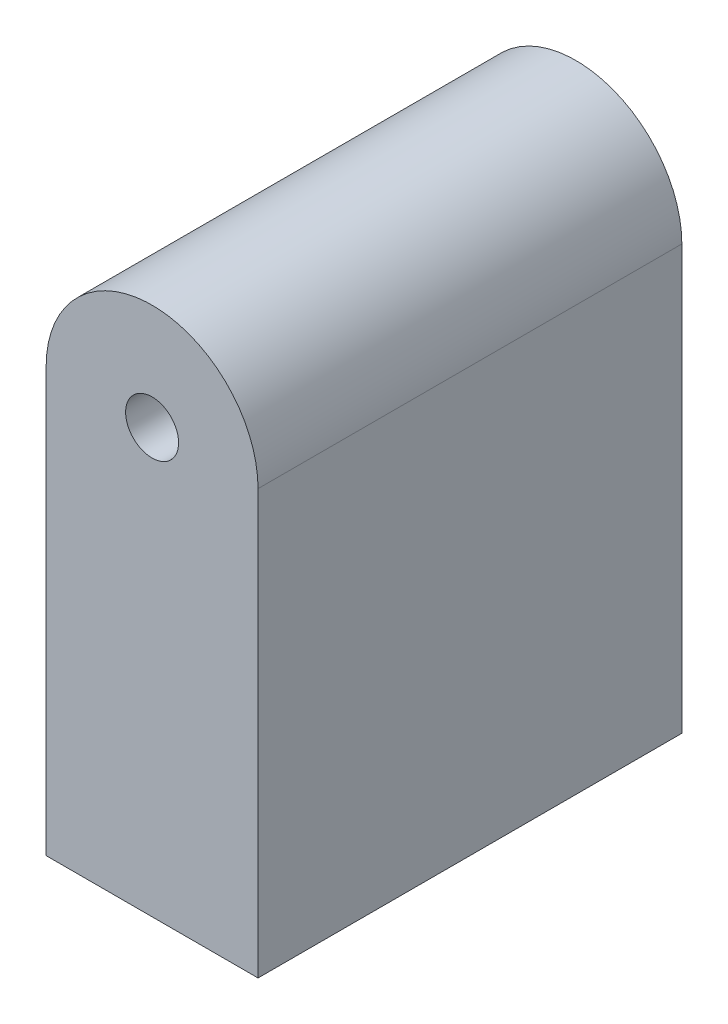
ISO-10303-21;
HEADER;
FILE_DESCRIPTION(('STEP AP214'),'2;1');
FILE_NAME('part.step','',(''),(''),'','','');
FILE_SCHEMA(('AUTOMOTIVE_DESIGN { 1 0 10303 214 1 1 1 1 }'));
ENDSEC;
DATA;
#1=APPLICATION_CONTEXT('core data for automotive mechanical design processes');
#2=APPLICATION_PROTOCOL_DEFINITION('international standard','automotive_design',2000,#1);
#3=PRODUCT_CONTEXT('',#1,'mechanical');
#4=PRODUCT('Part','Part','',(#3));
#5=PRODUCT_RELATED_PRODUCT_CATEGORY('part','',(#4));
#6=PRODUCT_DEFINITION_FORMATION('','',#4);
#7=PRODUCT_DEFINITION_CONTEXT('part definition',#1,'design');
#8=PRODUCT_DEFINITION('design','',#6,#7);
#9=PRODUCT_DEFINITION_SHAPE('','',#8);
#10=(LENGTH_UNIT() NAMED_UNIT(*) SI_UNIT(.MILLI.,.METRE.));
#11=(NAMED_UNIT(*) PLANE_ANGLE_UNIT() SI_UNIT($,.RADIAN.));
#12=(NAMED_UNIT(*) SI_UNIT($,.STERADIAN.) SOLID_ANGLE_UNIT());
#13=UNCERTAINTY_MEASURE_WITH_UNIT(LENGTH_MEASURE(1.E-05),#10,'distance_accuracy_value','');
#14=(GEOMETRIC_REPRESENTATION_CONTEXT(3) GLOBAL_UNCERTAINTY_ASSIGNED_CONTEXT((#13)) GLOBAL_UNIT_ASSIGNED_CONTEXT((#10,
#11,#12)) REPRESENTATION_CONTEXT('',''));
#15=CARTESIAN_POINT('',(0.,0.,0.));
#16=DIRECTION('',(0.,0.,1.));
#17=DIRECTION('',(1.,0.,0.));
#18=AXIS2_PLACEMENT_3D('',#15,#16,#17);
#19=CARTESIAN_POINT('',(12.7,50.8,50.8));
#20=DIRECTION('',(0.,0.,-1.));
#21=DIRECTION('',(-1.,0.,0.));
#22=AXIS2_PLACEMENT_3D('',#19,#20,#21);
#23=CYLINDRICAL_SURFACE('',#22,12.7);
#24=CARTESIAN_POINT('',(12.7,50.8,0.));
#25=DIRECTION('',(0.,0.,1.));
#26=DIRECTION('',(1.,0.,0.));
#27=AXIS2_PLACEMENT_3D('',#24,#25,#26);
#28=CIRCLE('',#27,12.7);
#29=CARTESIAN_POINT('',(25.4,50.8,0.));
#30=VERTEX_POINT('',#29);
#31=CARTESIAN_POINT('',(0.,50.8,0.));
#32=VERTEX_POINT('',#31);
#33=EDGE_CURVE('E120',#30,#32,#28,.T.);
#34=ORIENTED_EDGE('',*,*,#33,.T.);
#35=DIRECTION('',(0.,0.,-1.));
#36=VECTOR('',#35,1.);
#37=CARTESIAN_POINT('',(0.,50.8,50.8));
#38=LINE('',#37,#36);
#39=CARTESIAN_POINT('',(0.,50.8,50.8));
#40=VERTEX_POINT('',#39);
#41=EDGE_CURVE('E11',#40,#32,#38,.T.);
#42=ORIENTED_EDGE('',*,*,#41,.F.);
#43=CARTESIAN_POINT('',(12.7,50.8,50.8));
#44=DIRECTION('',(0.,0.,1.));
#45=DIRECTION('',(1.,0.,0.));
#46=AXIS2_PLACEMENT_3D('',#43,#44,#45);
#47=CIRCLE('',#46,12.7);
#48=CARTESIAN_POINT('',(25.4,50.8,50.8));
#49=VERTEX_POINT('',#48);
#50=EDGE_CURVE('E88',#49,#40,#47,.T.);
#51=ORIENTED_EDGE('',*,*,#50,.F.);
#52=DIRECTION('',(0.,0.,-1.));
#53=VECTOR('',#52,1.);
#54=CARTESIAN_POINT('',(25.4,50.8,50.8));
#55=LINE('',#54,#53);
#56=EDGE_CURVE('E119',#49,#30,#55,.T.);
#57=ORIENTED_EDGE('',*,*,#56,.T.);
#58=EDGE_LOOP('',(#34,#42,#51,#57));
#59=FACE_BOUND('',#58,.T.);
#60=ADVANCED_FACE('F45',(#59),#23,.T.);
#61=CARTESIAN_POINT('',(0.,0.,50.8));
#62=DIRECTION('',(-1.,0.,0.));
#63=DIRECTION('',(0.,-1.,0.));
#64=AXIS2_PLACEMENT_3D('',#61,#62,#63);
#65=PLANE('',#64);
#66=DIRECTION('',(0.,1.,0.));
#67=VECTOR('',#66,1.);
#68=CARTESIAN_POINT('',(0.,0.,0.));
#69=LINE('',#68,#67);
#70=CARTESIAN_POINT('',(0.,0.,0.));
#71=VERTEX_POINT('',#70);
#72=EDGE_CURVE('E98',#71,#32,#69,.T.);
#73=ORIENTED_EDGE('',*,*,#72,.F.);
#74=DIRECTION('',(0.,0.,-1.));
#75=VECTOR('',#74,1.);
#76=CARTESIAN_POINT('',(0.,0.,50.8));
#77=LINE('',#76,#75);
#78=CARTESIAN_POINT('',(0.,0.,50.8));
#79=VERTEX_POINT('',#78);
#80=EDGE_CURVE('E54',#79,#71,#77,.T.);
#81=ORIENTED_EDGE('',*,*,#80,.F.);
#82=DIRECTION('',(0.,1.,0.));
#83=VECTOR('',#82,1.);
#84=CARTESIAN_POINT('',(0.,0.,50.8));
#85=LINE('',#84,#83);
#86=EDGE_CURVE('E96',#79,#40,#85,.T.);
#87=ORIENTED_EDGE('',*,*,#86,.T.);
#88=ORIENTED_EDGE('',*,*,#41,.T.);
#89=EDGE_LOOP('',(#73,#81,#87,#88));
#90=FACE_BOUND('',#89,.T.);
#91=ADVANCED_FACE('F95',(#90),#65,.T.);
#92=CARTESIAN_POINT('',(0.,0.,50.8));
#93=DIRECTION('',(0.,1.,0.));
#94=DIRECTION('',(0.,0.,1.));
#95=AXIS2_PLACEMENT_3D('',#92,#93,#94);
#96=PLANE('',#95);
#97=DIRECTION('',(1.,0.,0.));
#98=VECTOR('',#97,1.);
#99=CARTESIAN_POINT('',(0.,0.,0.));
#100=LINE('',#99,#98);
#101=CARTESIAN_POINT('',(25.4,0.,0.));
#102=VERTEX_POINT('',#101);
#103=EDGE_CURVE('E77',#71,#102,#100,.T.);
#104=ORIENTED_EDGE('',*,*,#103,.T.);
#105=DIRECTION('',(0.,0.,-1.));
#106=VECTOR('',#105,1.);
#107=CARTESIAN_POINT('',(25.4,0.,50.8));
#108=LINE('',#107,#106);
#109=CARTESIAN_POINT('',(25.4,0.,50.8));
#110=VERTEX_POINT('',#109);
#111=EDGE_CURVE('E100',#110,#102,#108,.T.);
#112=ORIENTED_EDGE('',*,*,#111,.F.);
#113=DIRECTION('',(1.,0.,0.));
#114=VECTOR('',#113,1.);
#115=CARTESIAN_POINT('',(0.,0.,50.8));
#116=LINE('',#115,#114);
#117=EDGE_CURVE('E101',#79,#110,#116,.T.);
#118=ORIENTED_EDGE('',*,*,#117,.F.);
#119=ORIENTED_EDGE('',*,*,#80,.T.);
#120=EDGE_LOOP('',(#104,#112,#118,#119));
#121=FACE_BOUND('',#120,.T.);
#122=ADVANCED_FACE('F102',(#121),#96,.F.);
#123=CARTESIAN_POINT('',(25.4,0.,50.8));
#124=DIRECTION('',(-1.,0.,0.));
#125=DIRECTION('',(0.,0.,1.));
#126=AXIS2_PLACEMENT_3D('',#123,#124,#125);
#127=PLANE('',#126);
#128=DIRECTION('',(0.,1.,0.));
#129=VECTOR('',#128,1.);
#130=CARTESIAN_POINT('',(25.4,0.,0.));
#131=LINE('',#130,#129);
#132=EDGE_CURVE('E83',#102,#30,#131,.T.);
#133=ORIENTED_EDGE('',*,*,#132,.T.);
#134=ORIENTED_EDGE('',*,*,#56,.F.);
#135=DIRECTION('',(0.,1.,0.));
#136=VECTOR('',#135,1.);
#137=CARTESIAN_POINT('',(25.4,0.,50.8));
#138=LINE('',#137,#136);
#139=EDGE_CURVE('E62',#110,#49,#138,.T.);
#140=ORIENTED_EDGE('',*,*,#139,.F.);
#141=ORIENTED_EDGE('',*,*,#111,.T.);
#142=EDGE_LOOP('',(#133,#134,#140,#141));
#143=FACE_BOUND('',#142,.T.);
#144=ADVANCED_FACE('F136',(#143),#127,.F.);
#145=CARTESIAN_POINT('',(12.7,50.8,50.8));
#146=DIRECTION('',(0.,0.,-1.));
#147=DIRECTION('',(-1.,0.,0.));
#148=AXIS2_PLACEMENT_3D('',#145,#146,#147);
#149=CYLINDRICAL_SURFACE('',#148,3.175);
#150=CARTESIAN_POINT('',(12.7,50.8,50.8));
#151=DIRECTION('',(0.,0.,1.));
#152=DIRECTION('',(1.,0.,0.));
#153=AXIS2_PLACEMENT_3D('',#150,#151,#152);
#154=CIRCLE('',#153,3.175);
#155=CARTESIAN_POINT('',(15.875,50.8,50.8));
#156=VERTEX_POINT('',#155);
#157=EDGE_CURVE('E115',#156,#156,#154,.T.);
#158=ORIENTED_EDGE('',*,*,#157,.T.);
#159=EDGE_LOOP('',(#158));
#160=FACE_BOUND('',#159,.T.);
#161=CARTESIAN_POINT('',(12.7,50.8,0.));
#162=DIRECTION('',(0.,0.,1.));
#163=DIRECTION('',(1.,0.,0.));
#164=AXIS2_PLACEMENT_3D('',#161,#162,#163);
#165=CIRCLE('',#164,3.175);
#166=CARTESIAN_POINT('',(15.875,50.8,0.));
#167=VERTEX_POINT('',#166);
#168=EDGE_CURVE('E110',#167,#167,#165,.T.);
#169=ORIENTED_EDGE('',*,*,#168,.F.);
#170=EDGE_LOOP('',(#169));
#171=FACE_BOUND('',#170,.T.);
#172=ADVANCED_FACE('F153',(#160,#171),#149,.F.);
#173=CARTESIAN_POINT('',(0.,0.,50.8));
#174=DIRECTION('',(0.,0.,1.));
#175=DIRECTION('',(1.,0.,0.));
#176=AXIS2_PLACEMENT_3D('',#173,#174,#175);
#177=PLANE('',#176);
#178=ORIENTED_EDGE('',*,*,#50,.T.);
#179=ORIENTED_EDGE('',*,*,#86,.F.);
#180=ORIENTED_EDGE('',*,*,#117,.T.);
#181=ORIENTED_EDGE('',*,*,#139,.T.);
#182=EDGE_LOOP('',(#178,#179,#180,#181));
#183=FACE_BOUND('',#182,.T.);
#184=ORIENTED_EDGE('',*,*,#157,.F.);
#185=EDGE_LOOP('',(#184));
#186=FACE_BOUND('',#185,.T.);
#187=ADVANCED_FACE('F105',(#183,#186),#177,.T.);
#188=CARTESIAN_POINT('',(0.,0.,0.));
#189=DIRECTION('',(0.,0.,1.));
#190=DIRECTION('',(1.,0.,0.));
#191=AXIS2_PLACEMENT_3D('',#188,#189,#190);
#192=PLANE('',#191);
#193=ORIENTED_EDGE('',*,*,#33,.F.);
#194=ORIENTED_EDGE('',*,*,#132,.F.);
#195=ORIENTED_EDGE('',*,*,#103,.F.);
#196=ORIENTED_EDGE('',*,*,#72,.T.);
#197=EDGE_LOOP('',(#193,#194,#195,#196));
#198=FACE_BOUND('',#197,.T.);
#199=ORIENTED_EDGE('',*,*,#168,.T.);
#200=EDGE_LOOP('',(#199));
#201=FACE_BOUND('',#200,.T.);
#202=ADVANCED_FACE('F139',(#198,#201),#192,.F.);
#203=CLOSED_SHELL('',(#60,#91,#122,#144,#172,#187,#202));
#204=MANIFOLD_SOLID_BREP('B2',#203);
#205=ADVANCED_BREP_SHAPE_REPRESENTATION('',(#18,#204),#14);
#206=SHAPE_DEFINITION_REPRESENTATION(#9,#205);
ENDSEC;
END-ISO-10303-21;
